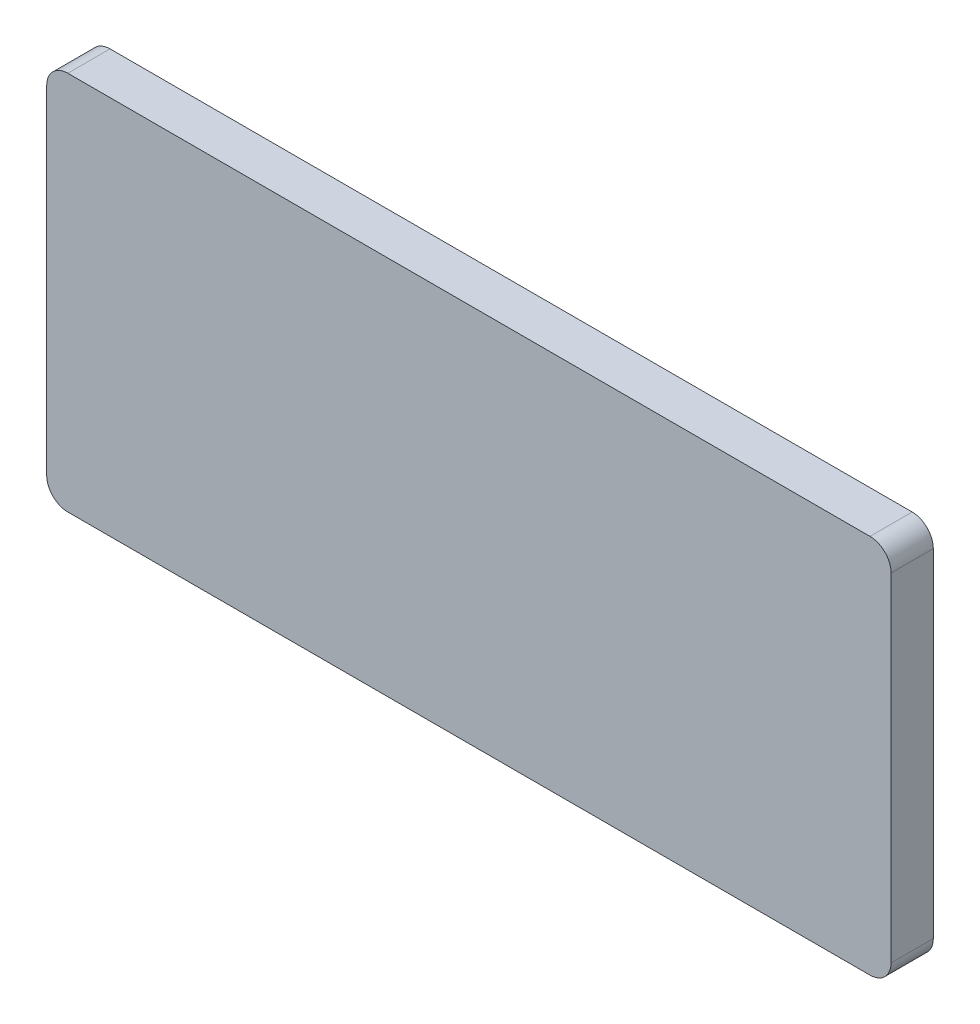
ISO-10303-21;
HEADER;
FILE_DESCRIPTION(('STEP AP214'),'2;1');
FILE_NAME('part.step','',(''),(''),'','','');
FILE_SCHEMA(('AUTOMOTIVE_DESIGN { 1 0 10303 214 1 1 1 1 }'));
ENDSEC;
DATA;
#1=APPLICATION_CONTEXT('core data for automotive mechanical design processes');
#2=APPLICATION_PROTOCOL_DEFINITION('international standard','automotive_design',2000,#1);
#3=PRODUCT_CONTEXT('',#1,'mechanical');
#4=PRODUCT('Part','Part','',(#3));
#5=PRODUCT_RELATED_PRODUCT_CATEGORY('part','',(#4));
#6=PRODUCT_DEFINITION_FORMATION('','',#4);
#7=PRODUCT_DEFINITION_CONTEXT('part definition',#1,'design');
#8=PRODUCT_DEFINITION('design','',#6,#7);
#9=PRODUCT_DEFINITION_SHAPE('','',#8);
#10=(LENGTH_UNIT() NAMED_UNIT(*) SI_UNIT(.MILLI.,.METRE.));
#11=(NAMED_UNIT(*) PLANE_ANGLE_UNIT() SI_UNIT($,.RADIAN.));
#12=(NAMED_UNIT(*) SI_UNIT($,.STERADIAN.) SOLID_ANGLE_UNIT());
#13=UNCERTAINTY_MEASURE_WITH_UNIT(LENGTH_MEASURE(1.E-05),#10,'distance_accuracy_value','');
#14=(GEOMETRIC_REPRESENTATION_CONTEXT(3) GLOBAL_UNCERTAINTY_ASSIGNED_CONTEXT((#13)) GLOBAL_UNIT_ASSIGNED_CONTEXT((#10,
#11,#12)) REPRESENTATION_CONTEXT('',''));
#15=CARTESIAN_POINT('',(0.,0.,0.));
#16=DIRECTION('',(0.,0.,1.));
#17=DIRECTION('',(1.,0.,0.));
#18=AXIS2_PLACEMENT_3D('',#15,#16,#17);
#19=CARTESIAN_POINT('',(-254.,-114.3,25.4));
#20=DIRECTION('',(-1.,0.,0.));
#21=DIRECTION('',(0.,0.,1.));
#22=AXIS2_PLACEMENT_3D('',#19,#20,#21);
#23=PLANE('',#22);
#24=DIRECTION('',(0.,1.,0.));
#25=VECTOR('',#24,1.);
#26=CARTESIAN_POINT('',(-254.,-114.3,25.4));
#27=LINE('',#26,#25);
#28=CARTESIAN_POINT('',(-254.,-101.6,25.4));
#29=VERTEX_POINT('',#28);
#30=CARTESIAN_POINT('',(-254.,101.6,25.4));
#31=VERTEX_POINT('',#30);
#32=EDGE_CURVE('E161',#29,#31,#27,.T.);
#33=ORIENTED_EDGE('',*,*,#32,.T.);
#34=DIRECTION('',(0.,0.,-1.));
#35=VECTOR('',#34,1.);
#36=CARTESIAN_POINT('',(-254.,101.6,25.4));
#37=LINE('',#36,#35);
#38=CARTESIAN_POINT('',(-254.,101.6,0.));
#39=VERTEX_POINT('',#38);
#40=EDGE_CURVE('E140',#31,#39,#37,.T.);
#41=ORIENTED_EDGE('',*,*,#40,.T.);
#42=DIRECTION('',(0.,1.,0.));
#43=VECTOR('',#42,1.);
#44=CARTESIAN_POINT('',(-254.,-114.3,0.));
#45=LINE('',#44,#43);
#46=CARTESIAN_POINT('',(-254.,-101.6,0.));
#47=VERTEX_POINT('',#46);
#48=EDGE_CURVE('E113',#47,#39,#45,.T.);
#49=ORIENTED_EDGE('',*,*,#48,.F.);
#50=DIRECTION('',(0.,0.,-1.));
#51=VECTOR('',#50,1.);
#52=CARTESIAN_POINT('',(-254.,-101.6,25.4));
#53=LINE('',#52,#51);
#54=EDGE_CURVE('E138',#47,#29,#53,.F.);
#55=ORIENTED_EDGE('',*,*,#54,.T.);
#56=EDGE_LOOP('',(#33,#41,#49,#55));
#57=FACE_BOUND('',#56,.T.);
#58=ADVANCED_FACE('F34',(#57),#23,.T.);
#59=CARTESIAN_POINT('',(-254.,-114.3,25.4));
#60=DIRECTION('',(0.,1.,0.));
#61=DIRECTION('',(0.,0.,1.));
#62=AXIS2_PLACEMENT_3D('',#59,#60,#61);
#63=PLANE('',#62);
#64=DIRECTION('',(1.,0.,0.));
#65=VECTOR('',#64,1.);
#66=CARTESIAN_POINT('',(-254.,-114.3,25.4));
#67=LINE('',#66,#65);
#68=CARTESIAN_POINT('',(-241.3,-114.3,25.4));
#69=VERTEX_POINT('',#68);
#70=CARTESIAN_POINT('',(241.3,-114.3,25.4));
#71=VERTEX_POINT('',#70);
#72=EDGE_CURVE('E127',#69,#71,#67,.T.);
#73=ORIENTED_EDGE('',*,*,#72,.F.);
#74=DIRECTION('',(0.,0.,-1.));
#75=VECTOR('',#74,1.);
#76=CARTESIAN_POINT('',(-241.3,-114.3,0.));
#77=LINE('',#76,#75);
#78=CARTESIAN_POINT('',(-241.3,-114.3,0.));
#79=VERTEX_POINT('',#78);
#80=EDGE_CURVE('E42',#69,#79,#77,.T.);
#81=ORIENTED_EDGE('',*,*,#80,.T.);
#82=DIRECTION('',(1.,0.,0.));
#83=VECTOR('',#82,1.);
#84=CARTESIAN_POINT('',(-254.,-114.3,0.));
#85=LINE('',#84,#83);
#86=CARTESIAN_POINT('',(241.3,-114.3,0.));
#87=VERTEX_POINT('',#86);
#88=EDGE_CURVE('E132',#79,#87,#85,.T.);
#89=ORIENTED_EDGE('',*,*,#88,.T.);
#90=DIRECTION('',(0.,0.,-1.));
#91=VECTOR('',#90,1.);
#92=CARTESIAN_POINT('',(241.3,-114.3,25.4));
#93=LINE('',#92,#91);
#94=EDGE_CURVE('E49',#87,#71,#93,.F.);
#95=ORIENTED_EDGE('',*,*,#94,.T.);
#96=EDGE_LOOP('',(#73,#81,#89,#95));
#97=FACE_BOUND('',#96,.T.);
#98=ADVANCED_FACE('F158',(#97),#63,.F.);
#99=CARTESIAN_POINT('',(254.,-114.3,25.4));
#100=DIRECTION('',(-1.,0.,0.));
#101=DIRECTION('',(0.,0.,1.));
#102=AXIS2_PLACEMENT_3D('',#99,#100,#101);
#103=PLANE('',#102);
#104=DIRECTION('',(0.,1.,0.));
#105=VECTOR('',#104,1.);
#106=CARTESIAN_POINT('',(254.,-114.3,25.4));
#107=LINE('',#106,#105);
#108=CARTESIAN_POINT('',(254.,-101.6,25.4));
#109=VERTEX_POINT('',#108);
#110=CARTESIAN_POINT('',(254.,101.6,25.4));
#111=VERTEX_POINT('',#110);
#112=EDGE_CURVE('E129',#109,#111,#107,.T.);
#113=ORIENTED_EDGE('',*,*,#112,.F.);
#114=DIRECTION('',(0.,0.,-1.));
#115=VECTOR('',#114,1.);
#116=CARTESIAN_POINT('',(254.,-101.6,25.4));
#117=LINE('',#116,#115);
#118=CARTESIAN_POINT('',(254.,-101.6,0.));
#119=VERTEX_POINT('',#118);
#120=EDGE_CURVE('E11',#109,#119,#117,.T.);
#121=ORIENTED_EDGE('',*,*,#120,.T.);
#122=DIRECTION('',(0.,1.,0.));
#123=VECTOR('',#122,1.);
#124=CARTESIAN_POINT('',(254.,-114.3,0.));
#125=LINE('',#124,#123);
#126=CARTESIAN_POINT('',(254.,101.6,0.));
#127=VERTEX_POINT('',#126);
#128=EDGE_CURVE('E112',#119,#127,#125,.T.);
#129=ORIENTED_EDGE('',*,*,#128,.T.);
#130=DIRECTION('',(0.,0.,-1.));
#131=VECTOR('',#130,1.);
#132=CARTESIAN_POINT('',(254.,101.6,25.4));
#133=LINE('',#132,#131);
#134=EDGE_CURVE('E121',#127,#111,#133,.F.);
#135=ORIENTED_EDGE('',*,*,#134,.T.);
#136=EDGE_LOOP('',(#113,#121,#129,#135));
#137=FACE_BOUND('',#136,.T.);
#138=ADVANCED_FACE('F172',(#137),#103,.F.);
#139=CARTESIAN_POINT('',(-254.,114.3,25.4));
#140=DIRECTION('',(0.,1.,0.));
#141=DIRECTION('',(0.,0.,1.));
#142=AXIS2_PLACEMENT_3D('',#139,#140,#141);
#143=PLANE('',#142);
#144=DIRECTION('',(1.,0.,0.));
#145=VECTOR('',#144,1.);
#146=CARTESIAN_POINT('',(-254.,114.3,0.));
#147=LINE('',#146,#145);
#148=CARTESIAN_POINT('',(-241.3,114.3,0.));
#149=VERTEX_POINT('',#148);
#150=CARTESIAN_POINT('',(241.3,114.3,0.));
#151=VERTEX_POINT('',#150);
#152=EDGE_CURVE('E101',#149,#151,#147,.T.);
#153=ORIENTED_EDGE('',*,*,#152,.F.);
#154=DIRECTION('',(0.,0.,-1.));
#155=VECTOR('',#154,1.);
#156=CARTESIAN_POINT('',(-241.3,114.3,25.4));
#157=LINE('',#156,#155);
#158=CARTESIAN_POINT('',(-241.3,114.3,25.4));
#159=VERTEX_POINT('',#158);
#160=EDGE_CURVE('E148',#149,#159,#157,.F.);
#161=ORIENTED_EDGE('',*,*,#160,.T.);
#162=DIRECTION('',(1.,0.,0.));
#163=VECTOR('',#162,1.);
#164=CARTESIAN_POINT('',(-254.,114.3,25.4));
#165=LINE('',#164,#163);
#166=CARTESIAN_POINT('',(241.3,114.3,25.4));
#167=VERTEX_POINT('',#166);
#168=EDGE_CURVE('E125',#159,#167,#165,.T.);
#169=ORIENTED_EDGE('',*,*,#168,.T.);
#170=DIRECTION('',(0.,0.,-1.));
#171=VECTOR('',#170,1.);
#172=CARTESIAN_POINT('',(241.3,114.3,0.));
#173=LINE('',#172,#171);
#174=EDGE_CURVE('E119',#167,#151,#173,.T.);
#175=ORIENTED_EDGE('',*,*,#174,.T.);
#176=EDGE_LOOP('',(#153,#161,#169,#175));
#177=FACE_BOUND('',#176,.T.);
#178=ADVANCED_FACE('F123',(#177),#143,.T.);
#179=CARTESIAN_POINT('',(0.,0.,25.4));
#180=DIRECTION('',(0.,0.,-1.));
#181=DIRECTION('',(-1.,0.,0.));
#182=AXIS2_PLACEMENT_3D('',#179,#180,#181);
#183=PLANE('',#182);
#184=ORIENTED_EDGE('',*,*,#168,.F.);
#185=CARTESIAN_POINT('',(-241.3,101.6,25.4));
#186=DIRECTION('',(0.,0.,-1.));
#187=DIRECTION('',(-1.,0.,0.));
#188=AXIS2_PLACEMENT_3D('',#185,#186,#187);
#189=CIRCLE('',#188,12.7);
#190=EDGE_CURVE('E153',#159,#31,#189,.F.);
#191=ORIENTED_EDGE('',*,*,#190,.T.);
#192=ORIENTED_EDGE('',*,*,#32,.F.);
#193=CARTESIAN_POINT('',(-241.3,-101.6,25.4));
#194=DIRECTION('',(0.,0.,-1.));
#195=DIRECTION('',(-1.,0.,0.));
#196=AXIS2_PLACEMENT_3D('',#193,#194,#195);
#197=CIRCLE('',#196,12.7);
#198=EDGE_CURVE('E56',#29,#69,#197,.F.);
#199=ORIENTED_EDGE('',*,*,#198,.T.);
#200=ORIENTED_EDGE('',*,*,#72,.T.);
#201=CARTESIAN_POINT('',(241.3,-101.6,25.4));
#202=DIRECTION('',(0.,0.,-1.));
#203=DIRECTION('',(-1.,0.,0.));
#204=AXIS2_PLACEMENT_3D('',#201,#202,#203);
#205=CIRCLE('',#204,12.7);
#206=EDGE_CURVE('E150',#71,#109,#205,.F.);
#207=ORIENTED_EDGE('',*,*,#206,.T.);
#208=ORIENTED_EDGE('',*,*,#112,.T.);
#209=CARTESIAN_POINT('',(241.3,101.6,25.4));
#210=DIRECTION('',(0.,0.,-1.));
#211=DIRECTION('',(-1.,0.,0.));
#212=AXIS2_PLACEMENT_3D('',#209,#210,#211);
#213=CIRCLE('',#212,12.7);
#214=EDGE_CURVE('E136',#111,#167,#213,.F.);
#215=ORIENTED_EDGE('',*,*,#214,.T.);
#216=EDGE_LOOP('',(#184,#191,#192,#199,#200,#207,#208,#215));
#217=FACE_BOUND('',#216,.T.);
#218=ADVANCED_FACE('F169',(#217),#183,.F.);
#219=CARTESIAN_POINT('',(0.,0.,0.));
#220=DIRECTION('',(0.,0.,-1.));
#221=DIRECTION('',(-1.,0.,0.));
#222=AXIS2_PLACEMENT_3D('',#219,#220,#221);
#223=PLANE('',#222);
#224=ORIENTED_EDGE('',*,*,#48,.T.);
#225=CARTESIAN_POINT('',(-241.3,101.6,0.));
#226=DIRECTION('',(0.,0.,-1.));
#227=DIRECTION('',(-1.,0.,0.));
#228=AXIS2_PLACEMENT_3D('',#225,#226,#227);
#229=CIRCLE('',#228,12.7);
#230=EDGE_CURVE('E108',#39,#149,#229,.T.);
#231=ORIENTED_EDGE('',*,*,#230,.T.);
#232=ORIENTED_EDGE('',*,*,#152,.T.);
#233=CARTESIAN_POINT('',(241.3,101.6,0.));
#234=DIRECTION('',(0.,0.,-1.));
#235=DIRECTION('',(-1.,0.,0.));
#236=AXIS2_PLACEMENT_3D('',#233,#234,#235);
#237=CIRCLE('',#236,12.7);
#238=EDGE_CURVE('E106',#151,#127,#237,.T.);
#239=ORIENTED_EDGE('',*,*,#238,.T.);
#240=ORIENTED_EDGE('',*,*,#128,.F.);
#241=CARTESIAN_POINT('',(241.3,-101.6,0.));
#242=DIRECTION('',(0.,0.,-1.));
#243=DIRECTION('',(-1.,0.,0.));
#244=AXIS2_PLACEMENT_3D('',#241,#242,#243);
#245=CIRCLE('',#244,12.7);
#246=EDGE_CURVE('E143',#119,#87,#245,.T.);
#247=ORIENTED_EDGE('',*,*,#246,.T.);
#248=ORIENTED_EDGE('',*,*,#88,.F.);
#249=CARTESIAN_POINT('',(-241.3,-101.6,0.));
#250=DIRECTION('',(0.,0.,-1.));
#251=DIRECTION('',(-1.,0.,0.));
#252=AXIS2_PLACEMENT_3D('',#249,#250,#251);
#253=CIRCLE('',#252,12.7);
#254=EDGE_CURVE('E145',#79,#47,#253,.T.);
#255=ORIENTED_EDGE('',*,*,#254,.T.);
#256=EDGE_LOOP('',(#224,#231,#232,#239,#240,#247,#248,#255));
#257=FACE_BOUND('',#256,.T.);
#258=ADVANCED_FACE('F104',(#257),#223,.T.);
#259=CARTESIAN_POINT('',(241.3,101.6,25.4));
#260=DIRECTION('',(0.,0.,1.));
#261=DIRECTION('',(1.,0.,0.));
#262=AXIS2_PLACEMENT_3D('',#259,#260,#261);
#263=CYLINDRICAL_SURFACE('',#262,12.7);
#264=ORIENTED_EDGE('',*,*,#214,.F.);
#265=ORIENTED_EDGE('',*,*,#134,.F.);
#266=ORIENTED_EDGE('',*,*,#238,.F.);
#267=ORIENTED_EDGE('',*,*,#174,.F.);
#268=EDGE_LOOP('',(#264,#265,#266,#267));
#269=FACE_BOUND('',#268,.T.);
#270=ADVANCED_FACE('F118',(#269),#263,.T.);
#271=CARTESIAN_POINT('',(-241.3,101.6,25.4));
#272=DIRECTION('',(0.,0.,-1.));
#273=DIRECTION('',(-1.,0.,0.));
#274=AXIS2_PLACEMENT_3D('',#271,#272,#273);
#275=CYLINDRICAL_SURFACE('',#274,12.7);
#276=ORIENTED_EDGE('',*,*,#190,.F.);
#277=ORIENTED_EDGE('',*,*,#160,.F.);
#278=ORIENTED_EDGE('',*,*,#230,.F.);
#279=ORIENTED_EDGE('',*,*,#40,.F.);
#280=EDGE_LOOP('',(#276,#277,#278,#279));
#281=FACE_BOUND('',#280,.T.);
#282=ADVANCED_FACE('F189',(#281),#275,.T.);
#283=CARTESIAN_POINT('',(-241.3,-101.6,25.4));
#284=DIRECTION('',(0.,0.,1.));
#285=DIRECTION('',(1.,0.,0.));
#286=AXIS2_PLACEMENT_3D('',#283,#284,#285);
#287=CYLINDRICAL_SURFACE('',#286,12.7);
#288=ORIENTED_EDGE('',*,*,#198,.F.);
#289=ORIENTED_EDGE('',*,*,#54,.F.);
#290=ORIENTED_EDGE('',*,*,#254,.F.);
#291=ORIENTED_EDGE('',*,*,#80,.F.);
#292=EDGE_LOOP('',(#288,#289,#290,#291));
#293=FACE_BOUND('',#292,.T.);
#294=ADVANCED_FACE('F191',(#293),#287,.T.);
#295=CARTESIAN_POINT('',(241.3,-101.6,25.4));
#296=DIRECTION('',(0.,0.,-1.));
#297=DIRECTION('',(-1.,0.,0.));
#298=AXIS2_PLACEMENT_3D('',#295,#296,#297);
#299=CYLINDRICAL_SURFACE('',#298,12.7);
#300=ORIENTED_EDGE('',*,*,#206,.F.);
#301=ORIENTED_EDGE('',*,*,#94,.F.);
#302=ORIENTED_EDGE('',*,*,#246,.F.);
#303=ORIENTED_EDGE('',*,*,#120,.F.);
#304=EDGE_LOOP('',(#300,#301,#302,#303));
#305=FACE_BOUND('',#304,.T.);
#306=ADVANCED_FACE('F36',(#305),#299,.T.);
#307=CLOSED_SHELL('',(#58,#98,#138,#178,#218,#258,#270,#282,#294,#306));
#308=MANIFOLD_SOLID_BREP('B2',#307);
#309=ADVANCED_BREP_SHAPE_REPRESENTATION('',(#18,#308),#14);
#310=SHAPE_DEFINITION_REPRESENTATION(#9,#309);
ENDSEC;
END-ISO-10303-21;
